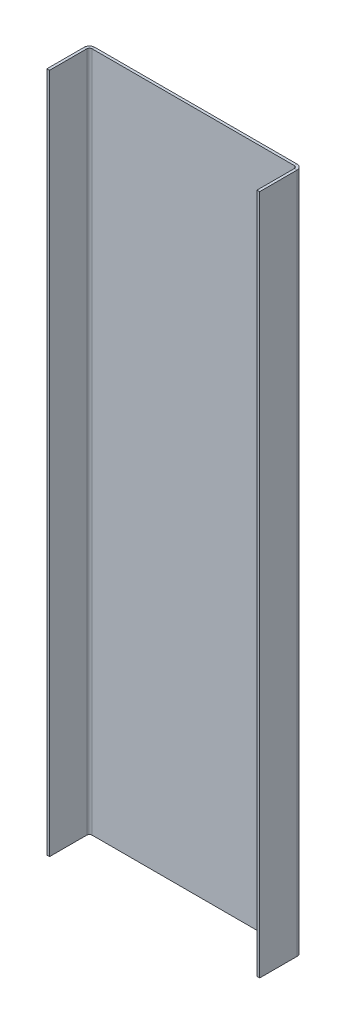
ISO-10303-21;
HEADER;
FILE_DESCRIPTION(('STEP AP214'),'2;1');
FILE_NAME('part.step','',(''),(''),'','','');
FILE_SCHEMA(('AUTOMOTIVE_DESIGN { 1 0 10303 214 1 1 1 1 }'));
ENDSEC;
DATA;
#1=APPLICATION_CONTEXT('core data for automotive mechanical design processes');
#2=APPLICATION_PROTOCOL_DEFINITION('international standard','automotive_design',2000,#1);
#3=PRODUCT_CONTEXT('',#1,'mechanical');
#4=PRODUCT('Part','Part','',(#3));
#5=PRODUCT_RELATED_PRODUCT_CATEGORY('part','',(#4));
#6=PRODUCT_DEFINITION_FORMATION('','',#4);
#7=PRODUCT_DEFINITION_CONTEXT('part definition',#1,'design');
#8=PRODUCT_DEFINITION('design','',#6,#7);
#9=PRODUCT_DEFINITION_SHAPE('','',#8);
#10=(LENGTH_UNIT() NAMED_UNIT(*) SI_UNIT(.MILLI.,.METRE.));
#11=(NAMED_UNIT(*) PLANE_ANGLE_UNIT() SI_UNIT($,.RADIAN.));
#12=(NAMED_UNIT(*) SI_UNIT($,.STERADIAN.) SOLID_ANGLE_UNIT());
#13=UNCERTAINTY_MEASURE_WITH_UNIT(LENGTH_MEASURE(1.E-05),#10,'distance_accuracy_value','');
#14=(GEOMETRIC_REPRESENTATION_CONTEXT(3) GLOBAL_UNCERTAINTY_ASSIGNED_CONTEXT((#13)) GLOBAL_UNIT_ASSIGNED_CONTEXT((#10,
#11,#12)) REPRESENTATION_CONTEXT('',''));
#15=CARTESIAN_POINT('',(0.,0.,0.));
#16=DIRECTION('',(0.,0.,1.));
#17=DIRECTION('',(1.,0.,0.));
#18=AXIS2_PLACEMENT_3D('',#15,#16,#17);
#19=CARTESIAN_POINT('',(0.,0.,1.5875));
#20=DIRECTION('',(0.,0.,-1.));
#21=DIRECTION('',(-1.,0.,0.));
#22=AXIS2_PLACEMENT_3D('',#19,#20,#21);
#23=PLANE('',#22);
#24=DIRECTION('',(0.,-1.,0.));
#25=VECTOR('',#24,1.);
#26=CARTESIAN_POINT('',(3.17499999999999,0.,1.5875));
#27=LINE('',#26,#25);
#28=CARTESIAN_POINT('',(3.17499999999999,0.,1.5875));
#29=VERTEX_POINT('',#28);
#30=CARTESIAN_POINT('',(3.17499999999999,406.4,1.5875));
#31=VERTEX_POINT('',#30);
#32=EDGE_CURVE('E228',#29,#31,#27,.F.);
#33=ORIENTED_EDGE('',*,*,#32,.F.);
#34=DIRECTION('',(1.,0.,0.));
#35=VECTOR('',#34,1.);
#36=CARTESIAN_POINT('',(0.,0.,1.5875));
#37=LINE('',#36,#35);
#38=CARTESIAN_POINT('',(123.825,0.,1.58749999999998));
#39=VERTEX_POINT('',#38);
#40=EDGE_CURVE('E94',#29,#39,#37,.T.);
#41=ORIENTED_EDGE('',*,*,#40,.T.);
#42=DIRECTION('',(0.,1.,0.));
#43=VECTOR('',#42,1.);
#44=CARTESIAN_POINT('',(123.825,406.4,1.58749999999998));
#45=LINE('',#44,#43);
#46=CARTESIAN_POINT('',(123.825,406.4,1.58749999999998));
#47=VERTEX_POINT('',#46);
#48=EDGE_CURVE('E279',#47,#39,#45,.F.);
#49=ORIENTED_EDGE('',*,*,#48,.F.);
#50=DIRECTION('',(-1.,0.,0.));
#51=VECTOR('',#50,1.);
#52=CARTESIAN_POINT('',(0.,406.4,1.5875));
#53=LINE('',#52,#51);
#54=EDGE_CURVE('E13',#47,#31,#53,.T.);
#55=ORIENTED_EDGE('',*,*,#54,.T.);
#56=EDGE_LOOP('',(#33,#41,#49,#55));
#57=FACE_BOUND('',#56,.T.);
#58=ADVANCED_FACE('F85',(#57),#23,.F.);
#59=CARTESIAN_POINT('',(0.,0.,0.));
#60=DIRECTION('',(0.,0.,-1.));
#61=DIRECTION('',(-1.,0.,0.));
#62=AXIS2_PLACEMENT_3D('',#59,#60,#61);
#63=PLANE('',#62);
#64=DIRECTION('',(-1.,0.,0.));
#65=VECTOR('',#64,1.);
#66=CARTESIAN_POINT('',(0.,0.,0.));
#67=LINE('',#66,#65);
#68=CARTESIAN_POINT('',(3.17499999999999,0.,0.));
#69=VERTEX_POINT('',#68);
#70=CARTESIAN_POINT('',(123.825,0.,0.));
#71=VERTEX_POINT('',#70);
#72=EDGE_CURVE('E89',#69,#71,#67,.F.);
#73=ORIENTED_EDGE('',*,*,#72,.F.);
#74=DIRECTION('',(0.,-1.,0.));
#75=VECTOR('',#74,1.);
#76=CARTESIAN_POINT('',(3.17499999999999,0.,0.));
#77=LINE('',#76,#75);
#78=CARTESIAN_POINT('',(3.17499999999999,406.4,0.));
#79=VERTEX_POINT('',#78);
#80=EDGE_CURVE('E217',#69,#79,#77,.F.);
#81=ORIENTED_EDGE('',*,*,#80,.T.);
#82=DIRECTION('',(-1.,0.,0.));
#83=VECTOR('',#82,1.);
#84=CARTESIAN_POINT('',(0.,406.4,0.));
#85=LINE('',#84,#83);
#86=CARTESIAN_POINT('',(123.825,406.4,0.));
#87=VERTEX_POINT('',#86);
#88=EDGE_CURVE('E288',#87,#79,#85,.T.);
#89=ORIENTED_EDGE('',*,*,#88,.F.);
#90=DIRECTION('',(0.,1.,0.));
#91=VECTOR('',#90,1.);
#92=CARTESIAN_POINT('',(123.825,406.4,0.));
#93=LINE('',#92,#91);
#94=EDGE_CURVE('E268',#87,#71,#93,.F.);
#95=ORIENTED_EDGE('',*,*,#94,.T.);
#96=EDGE_LOOP('',(#73,#81,#89,#95));
#97=FACE_BOUND('',#96,.T.);
#98=ADVANCED_FACE('F299',(#97),#63,.T.);
#99=CARTESIAN_POINT('',(0.,0.,1.5875));
#100=DIRECTION('',(0.,1.,0.));
#101=DIRECTION('',(1.,0.,0.));
#102=AXIS2_PLACEMENT_3D('',#99,#100,#101);
#103=PLANE('',#102);
#104=ORIENTED_EDGE('',*,*,#40,.F.);
#105=DIRECTION('',(0.,0.,-1.));
#106=VECTOR('',#105,1.);
#107=CARTESIAN_POINT('',(3.17499999999999,0.,1.5875));
#108=LINE('',#107,#106);
#109=EDGE_CURVE('E222',#29,#69,#108,.T.);
#110=ORIENTED_EDGE('',*,*,#109,.T.);
#111=ORIENTED_EDGE('',*,*,#72,.T.);
#112=DIRECTION('',(0.,0.,-1.));
#113=VECTOR('',#112,1.);
#114=CARTESIAN_POINT('',(123.825,0.,1.58749999999998));
#115=LINE('',#114,#113);
#116=EDGE_CURVE('E283',#39,#71,#115,.T.);
#117=ORIENTED_EDGE('',*,*,#116,.F.);
#118=EDGE_LOOP('',(#104,#110,#111,#117));
#119=FACE_BOUND('',#118,.T.);
#120=ADVANCED_FACE('F87',(#119),#103,.F.);
#121=CARTESIAN_POINT('',(0.,406.4,1.5875));
#122=DIRECTION('',(0.,-1.,0.));
#123=DIRECTION('',(-1.,0.,0.));
#124=AXIS2_PLACEMENT_3D('',#121,#122,#123);
#125=PLANE('',#124);
#126=DIRECTION('',(0.,0.,-1.));
#127=VECTOR('',#126,1.);
#128=CARTESIAN_POINT('',(3.17499999999999,406.4,1.5875));
#129=LINE('',#128,#127);
#130=EDGE_CURVE('E233',#31,#79,#129,.T.);
#131=ORIENTED_EDGE('',*,*,#130,.F.);
#132=ORIENTED_EDGE('',*,*,#54,.F.);
#133=DIRECTION('',(0.,0.,-1.));
#134=VECTOR('',#133,1.);
#135=CARTESIAN_POINT('',(123.825,406.4,1.58749999999998));
#136=LINE('',#135,#134);
#137=EDGE_CURVE('E273',#47,#87,#136,.T.);
#138=ORIENTED_EDGE('',*,*,#137,.T.);
#139=ORIENTED_EDGE('',*,*,#88,.T.);
#140=EDGE_LOOP('',(#131,#132,#138,#139));
#141=FACE_BOUND('',#140,.T.);
#142=ADVANCED_FACE('F307',(#141),#125,.F.);
#143=CARTESIAN_POINT('',(123.825,0.,3.17499999999999));
#144=DIRECTION('',(0.,-1.,0.));
#145=DIRECTION('',(0.,0.,-1.));
#146=AXIS2_PLACEMENT_3D('',#143,#144,#145);
#147=PLANE('',#146);
#148=DIRECTION('',(-1.,0.,0.));
#149=VECTOR('',#148,1.);
#150=CARTESIAN_POINT('',(127.,0.,3.17499999999998));
#151=LINE('',#150,#149);
#152=CARTESIAN_POINT('',(125.4125,0.,3.17499999999998));
#153=VERTEX_POINT('',#152);
#154=CARTESIAN_POINT('',(127.,0.,3.17499999999998));
#155=VERTEX_POINT('',#154);
#156=EDGE_CURVE('E235',#153,#155,#151,.F.);
#157=ORIENTED_EDGE('',*,*,#156,.F.);
#158=CARTESIAN_POINT('',(123.825,0.,3.17499999999999));
#159=DIRECTION('',(0.,1.,0.));
#160=DIRECTION('',(0.,0.,1.));
#161=AXIS2_PLACEMENT_3D('',#158,#159,#160);
#162=CIRCLE('',#161,1.58750000000001);
#163=EDGE_CURVE('E276',#39,#153,#162,.F.);
#164=ORIENTED_EDGE('',*,*,#163,.F.);
#165=ORIENTED_EDGE('',*,*,#116,.T.);
#166=CARTESIAN_POINT('',(123.825,0.,3.17499999999999));
#167=DIRECTION('',(0.,1.,0.));
#168=DIRECTION('',(0.,0.,1.));
#169=AXIS2_PLACEMENT_3D('',#166,#167,#168);
#170=CIRCLE('',#169,3.17500000000001);
#171=EDGE_CURVE('E102',#71,#155,#170,.F.);
#172=ORIENTED_EDGE('',*,*,#171,.T.);
#173=EDGE_LOOP('',(#157,#164,#165,#172));
#174=FACE_BOUND('',#173,.T.);
#175=ADVANCED_FACE('F316',(#174),#147,.T.);
#176=CARTESIAN_POINT('',(123.825,406.4,3.17499999999999));
#177=DIRECTION('',(0.,-1.,0.));
#178=DIRECTION('',(0.,0.,-1.));
#179=AXIS2_PLACEMENT_3D('',#176,#177,#178);
#180=PLANE('',#179);
#181=CARTESIAN_POINT('',(123.825,406.4,3.17499999999999));
#182=DIRECTION('',(0.,1.,0.));
#183=DIRECTION('',(0.,0.,1.));
#184=AXIS2_PLACEMENT_3D('',#181,#182,#183);
#185=CIRCLE('',#184,1.58750000000001);
#186=CARTESIAN_POINT('',(125.4125,406.4,3.17499999999998));
#187=VERTEX_POINT('',#186);
#188=EDGE_CURVE('E241',#187,#47,#185,.T.);
#189=ORIENTED_EDGE('',*,*,#188,.F.);
#190=DIRECTION('',(-1.,0.,0.));
#191=VECTOR('',#190,1.);
#192=CARTESIAN_POINT('',(125.4125,406.4,3.17499999999998));
#193=LINE('',#192,#191);
#194=CARTESIAN_POINT('',(127.,406.4,3.17499999999998));
#195=VERTEX_POINT('',#194);
#196=EDGE_CURVE('E261',#187,#195,#193,.F.);
#197=ORIENTED_EDGE('',*,*,#196,.T.);
#198=CARTESIAN_POINT('',(123.825,406.4,3.17499999999999));
#199=DIRECTION('',(0.,1.,0.));
#200=DIRECTION('',(0.,0.,1.));
#201=AXIS2_PLACEMENT_3D('',#198,#199,#200);
#202=CIRCLE('',#201,3.17500000000001);
#203=EDGE_CURVE('E271',#195,#87,#202,.T.);
#204=ORIENTED_EDGE('',*,*,#203,.T.);
#205=ORIENTED_EDGE('',*,*,#137,.F.);
#206=EDGE_LOOP('',(#189,#197,#204,#205));
#207=FACE_BOUND('',#206,.T.);
#208=ADVANCED_FACE('F303',(#207),#180,.F.);
#209=CARTESIAN_POINT('',(123.825,406.4,3.17499999999999));
#210=DIRECTION('',(0.,1.,0.));
#211=DIRECTION('',(1.,0.,0.));
#212=AXIS2_PLACEMENT_3D('',#209,#210,#211);
#213=CYLINDRICAL_SURFACE('',#212,3.17500000000001);
#214=ORIENTED_EDGE('',*,*,#94,.F.);
#215=ORIENTED_EDGE('',*,*,#203,.F.);
#216=DIRECTION('',(0.,1.,0.));
#217=VECTOR('',#216,1.);
#218=CARTESIAN_POINT('',(127.,0.,3.17499999999998));
#219=LINE('',#218,#217);
#220=EDGE_CURVE('E259',#195,#155,#219,.F.);
#221=ORIENTED_EDGE('',*,*,#220,.T.);
#222=ORIENTED_EDGE('',*,*,#171,.F.);
#223=EDGE_LOOP('',(#214,#215,#221,#222));
#224=FACE_BOUND('',#223,.T.);
#225=ADVANCED_FACE('F300',(#224),#213,.T.);
#226=CARTESIAN_POINT('',(123.825,406.4,3.17499999999999));
#227=DIRECTION('',(0.,1.,0.));
#228=DIRECTION('',(1.,0.,0.));
#229=AXIS2_PLACEMENT_3D('',#226,#227,#228);
#230=CYLINDRICAL_SURFACE('',#229,1.58750000000001);
#231=ORIENTED_EDGE('',*,*,#48,.T.);
#232=ORIENTED_EDGE('',*,*,#163,.T.);
#233=DIRECTION('',(0.,1.,0.));
#234=VECTOR('',#233,1.);
#235=CARTESIAN_POINT('',(125.4125,0.,3.17499999999998));
#236=LINE('',#235,#234);
#237=EDGE_CURVE('E264',#153,#187,#236,.T.);
#238=ORIENTED_EDGE('',*,*,#237,.T.);
#239=ORIENTED_EDGE('',*,*,#188,.T.);
#240=EDGE_LOOP('',(#231,#232,#238,#239));
#241=FACE_BOUND('',#240,.T.);
#242=ADVANCED_FACE('F313',(#241),#230,.F.);
#243=CARTESIAN_POINT('',(127.,406.4,25.4));
#244=DIRECTION('',(0.,-1.,0.));
#245=DIRECTION('',(0.,0.,-1.));
#246=AXIS2_PLACEMENT_3D('',#243,#244,#245);
#247=PLANE('',#246);
#248=ORIENTED_EDGE('',*,*,#196,.F.);
#249=DIRECTION('',(0.,0.,-1.));
#250=VECTOR('',#249,1.);
#251=CARTESIAN_POINT('',(125.4125,406.4,25.4));
#252=LINE('',#251,#250);
#253=CARTESIAN_POINT('',(125.4125,406.4,25.4));
#254=VERTEX_POINT('',#253);
#255=EDGE_CURVE('E257',#187,#254,#252,.F.);
#256=ORIENTED_EDGE('',*,*,#255,.T.);
#257=DIRECTION('',(-1.,0.,0.));
#258=VECTOR('',#257,1.);
#259=CARTESIAN_POINT('',(127.,406.4,25.4));
#260=LINE('',#259,#258);
#261=CARTESIAN_POINT('',(127.,406.4,25.4));
#262=VERTEX_POINT('',#261);
#263=EDGE_CURVE('E238',#262,#254,#260,.T.);
#264=ORIENTED_EDGE('',*,*,#263,.F.);
#265=DIRECTION('',(0.,0.,1.));
#266=VECTOR('',#265,1.);
#267=CARTESIAN_POINT('',(127.,406.4,-4.49631936475476E-13));
#268=LINE('',#267,#266);
#269=EDGE_CURVE('E250',#195,#262,#268,.T.);
#270=ORIENTED_EDGE('',*,*,#269,.F.);
#271=EDGE_LOOP('',(#248,#256,#264,#270));
#272=FACE_BOUND('',#271,.T.);
#273=ADVANCED_FACE('F334',(#272),#247,.F.);
#274=CARTESIAN_POINT('',(127.,0.,1.58749999999999));
#275=DIRECTION('',(0.,1.,0.));
#276=DIRECTION('',(0.,0.,1.));
#277=AXIS2_PLACEMENT_3D('',#274,#275,#276);
#278=PLANE('',#277);
#279=ORIENTED_EDGE('',*,*,#156,.T.);
#280=DIRECTION('',(0.,0.,-1.));
#281=VECTOR('',#280,1.);
#282=CARTESIAN_POINT('',(127.,0.,-4.49631936475476E-13));
#283=LINE('',#282,#281);
#284=CARTESIAN_POINT('',(127.,0.,25.4));
#285=VERTEX_POINT('',#284);
#286=EDGE_CURVE('E245',#285,#155,#283,.T.);
#287=ORIENTED_EDGE('',*,*,#286,.F.);
#288=DIRECTION('',(-1.,0.,0.));
#289=VECTOR('',#288,1.);
#290=CARTESIAN_POINT('',(127.,0.,25.4));
#291=LINE('',#290,#289);
#292=CARTESIAN_POINT('',(125.4125,0.,25.4));
#293=VERTEX_POINT('',#292);
#294=EDGE_CURVE('E242',#285,#293,#291,.T.);
#295=ORIENTED_EDGE('',*,*,#294,.T.);
#296=DIRECTION('',(0.,0.,1.));
#297=VECTOR('',#296,1.);
#298=CARTESIAN_POINT('',(125.4125,0.,1.5875));
#299=LINE('',#298,#297);
#300=EDGE_CURVE('E252',#293,#153,#299,.F.);
#301=ORIENTED_EDGE('',*,*,#300,.T.);
#302=EDGE_LOOP('',(#279,#287,#295,#301));
#303=FACE_BOUND('',#302,.T.);
#304=ADVANCED_FACE('F319',(#303),#278,.F.);
#305=CARTESIAN_POINT('',(127.,0.,-4.49631936475476E-13));
#306=DIRECTION('',(-1.,0.,0.));
#307=DIRECTION('',(0.,0.,1.));
#308=AXIS2_PLACEMENT_3D('',#305,#306,#307);
#309=PLANE('',#308);
#310=ORIENTED_EDGE('',*,*,#220,.F.);
#311=ORIENTED_EDGE('',*,*,#269,.T.);
#312=DIRECTION('',(0.,-1.,0.));
#313=VECTOR('',#312,1.);
#314=CARTESIAN_POINT('',(127.,0.,25.4));
#315=LINE('',#314,#313);
#316=EDGE_CURVE('E248',#262,#285,#315,.T.);
#317=ORIENTED_EDGE('',*,*,#316,.T.);
#318=ORIENTED_EDGE('',*,*,#286,.T.);
#319=EDGE_LOOP('',(#310,#311,#317,#318));
#320=FACE_BOUND('',#319,.T.);
#321=ADVANCED_FACE('F322',(#320),#309,.F.);
#322=CARTESIAN_POINT('',(125.4125,0.,-4.44089209850063E-13));
#323=DIRECTION('',(-1.,0.,0.));
#324=DIRECTION('',(0.,0.,1.));
#325=AXIS2_PLACEMENT_3D('',#322,#323,#324);
#326=PLANE('',#325);
#327=ORIENTED_EDGE('',*,*,#255,.F.);
#328=ORIENTED_EDGE('',*,*,#237,.F.);
#329=ORIENTED_EDGE('',*,*,#300,.F.);
#330=DIRECTION('',(0.,1.,0.));
#331=VECTOR('',#330,1.);
#332=CARTESIAN_POINT('',(125.4125,0.,25.4));
#333=LINE('',#332,#331);
#334=EDGE_CURVE('E255',#254,#293,#333,.F.);
#335=ORIENTED_EDGE('',*,*,#334,.F.);
#336=EDGE_LOOP('',(#327,#328,#329,#335));
#337=FACE_BOUND('',#336,.T.);
#338=ADVANCED_FACE('F332',(#337),#326,.T.);
#339=CARTESIAN_POINT('',(127.,0.,25.4));
#340=DIRECTION('',(0.,0.,-1.));
#341=DIRECTION('',(-1.,0.,0.));
#342=AXIS2_PLACEMENT_3D('',#339,#340,#341);
#343=PLANE('',#342);
#344=ORIENTED_EDGE('',*,*,#334,.T.);
#345=ORIENTED_EDGE('',*,*,#294,.F.);
#346=ORIENTED_EDGE('',*,*,#316,.F.);
#347=ORIENTED_EDGE('',*,*,#263,.T.);
#348=EDGE_LOOP('',(#344,#345,#346,#347));
#349=FACE_BOUND('',#348,.T.);
#350=ADVANCED_FACE('F328',(#349),#343,.F.);
#351=CARTESIAN_POINT('',(3.17499999999999,406.4,3.175));
#352=DIRECTION('',(0.,1.,0.));
#353=DIRECTION('',(0.,0.,1.));
#354=AXIS2_PLACEMENT_3D('',#351,#352,#353);
#355=PLANE('',#354);
#356=DIRECTION('',(1.,0.,0.));
#357=VECTOR('',#356,1.);
#358=CARTESIAN_POINT('',(0.,406.4,3.17499999999999));
#359=LINE('',#358,#357);
#360=CARTESIAN_POINT('',(1.58749999999999,406.4,3.17499999999999));
#361=VERTEX_POINT('',#360);
#362=CARTESIAN_POINT('',(0.,406.4,3.17499999999999));
#363=VERTEX_POINT('',#362);
#364=EDGE_CURVE('E200',#361,#363,#359,.F.);
#365=ORIENTED_EDGE('',*,*,#364,.F.);
#366=CARTESIAN_POINT('',(3.17499999999999,406.4,3.175));
#367=DIRECTION('',(0.,-1.,0.));
#368=DIRECTION('',(0.,0.,-1.));
#369=AXIS2_PLACEMENT_3D('',#366,#367,#368);
#370=CIRCLE('',#369,1.5875);
#371=EDGE_CURVE('E225',#31,#361,#370,.F.);
#372=ORIENTED_EDGE('',*,*,#371,.F.);
#373=ORIENTED_EDGE('',*,*,#130,.T.);
#374=CARTESIAN_POINT('',(3.17499999999999,406.4,3.175));
#375=DIRECTION('',(0.,-1.,0.));
#376=DIRECTION('',(0.,0.,-1.));
#377=AXIS2_PLACEMENT_3D('',#374,#375,#376);
#378=CIRCLE('',#377,3.175);
#379=EDGE_CURVE('E110',#79,#363,#378,.F.);
#380=ORIENTED_EDGE('',*,*,#379,.T.);
#381=EDGE_LOOP('',(#365,#372,#373,#380));
#382=FACE_BOUND('',#381,.T.);
#383=ADVANCED_FACE('F444',(#382),#355,.T.);
#384=CARTESIAN_POINT('',(3.17499999999999,0.,3.175));
#385=DIRECTION('',(0.,1.,0.));
#386=DIRECTION('',(0.,0.,1.));
#387=AXIS2_PLACEMENT_3D('',#384,#385,#386);
#388=PLANE('',#387);
#389=CARTESIAN_POINT('',(3.17499999999999,0.,3.175));
#390=DIRECTION('',(0.,-1.,0.));
#391=DIRECTION('',(0.,0.,-1.));
#392=AXIS2_PLACEMENT_3D('',#389,#390,#391);
#393=CIRCLE('',#392,1.5875);
#394=CARTESIAN_POINT('',(1.58749999999999,0.,3.17499999999999));
#395=VERTEX_POINT('',#394);
#396=EDGE_CURVE('E230',#395,#29,#393,.T.);
#397=ORIENTED_EDGE('',*,*,#396,.F.);
#398=DIRECTION('',(1.,0.,0.));
#399=VECTOR('',#398,1.);
#400=CARTESIAN_POINT('',(1.58749999999999,0.,3.17499999999999));
#401=LINE('',#400,#399);
#402=CARTESIAN_POINT('',(0.,0.,3.17499999999999));
#403=VERTEX_POINT('',#402);
#404=EDGE_CURVE('E211',#395,#403,#401,.F.);
#405=ORIENTED_EDGE('',*,*,#404,.T.);
#406=CARTESIAN_POINT('',(3.17499999999999,0.,3.175));
#407=DIRECTION('',(0.,-1.,0.));
#408=DIRECTION('',(0.,0.,-1.));
#409=AXIS2_PLACEMENT_3D('',#406,#407,#408);
#410=CIRCLE('',#409,3.175);
#411=EDGE_CURVE('E220',#403,#69,#410,.T.);
#412=ORIENTED_EDGE('',*,*,#411,.T.);
#413=ORIENTED_EDGE('',*,*,#109,.F.);
#414=EDGE_LOOP('',(#397,#405,#412,#413));
#415=FACE_BOUND('',#414,.T.);
#416=ADVANCED_FACE('F453',(#415),#388,.F.);
#417=CARTESIAN_POINT('',(3.17499999999999,0.,3.175));
#418=DIRECTION('',(0.,-1.,0.));
#419=DIRECTION('',(-1.,0.,0.));
#420=AXIS2_PLACEMENT_3D('',#417,#418,#419);
#421=CYLINDRICAL_SURFACE('',#420,3.175);
#422=ORIENTED_EDGE('',*,*,#80,.F.);
#423=ORIENTED_EDGE('',*,*,#411,.F.);
#424=DIRECTION('',(0.,-1.,0.));
#425=VECTOR('',#424,1.);
#426=CARTESIAN_POINT('',(0.,406.4,3.17499999999999));
#427=LINE('',#426,#425);
#428=EDGE_CURVE('E209',#403,#363,#427,.F.);
#429=ORIENTED_EDGE('',*,*,#428,.T.);
#430=ORIENTED_EDGE('',*,*,#379,.F.);
#431=EDGE_LOOP('',(#422,#423,#429,#430));
#432=FACE_BOUND('',#431,.T.);
#433=ADVANCED_FACE('F464',(#432),#421,.T.);
#434=CARTESIAN_POINT('',(3.17499999999999,0.,3.175));
#435=DIRECTION('',(0.,-1.,0.));
#436=DIRECTION('',(-1.,0.,0.));
#437=AXIS2_PLACEMENT_3D('',#434,#435,#436);
#438=CYLINDRICAL_SURFACE('',#437,1.5875);
#439=ORIENTED_EDGE('',*,*,#32,.T.);
#440=ORIENTED_EDGE('',*,*,#371,.T.);
#441=DIRECTION('',(0.,-1.,0.));
#442=VECTOR('',#441,1.);
#443=CARTESIAN_POINT('',(1.58749999999999,406.4,3.17499999999999));
#444=LINE('',#443,#442);
#445=EDGE_CURVE('E214',#361,#395,#444,.T.);
#446=ORIENTED_EDGE('',*,*,#445,.T.);
#447=ORIENTED_EDGE('',*,*,#396,.T.);
#448=EDGE_LOOP('',(#439,#440,#446,#447));
#449=FACE_BOUND('',#448,.T.);
#450=ADVANCED_FACE('F475',(#449),#438,.F.);
#451=CARTESIAN_POINT('',(0.,406.4,1.58749999999999));
#452=DIRECTION('',(0.,-1.,0.));
#453=DIRECTION('',(0.,0.,-1.));
#454=AXIS2_PLACEMENT_3D('',#451,#452,#453);
#455=PLANE('',#454);
#456=ORIENTED_EDGE('',*,*,#364,.T.);
#457=DIRECTION('',(0.,0.,-1.));
#458=VECTOR('',#457,1.);
#459=CARTESIAN_POINT('',(0.,406.4,0.));
#460=LINE('',#459,#458);
#461=CARTESIAN_POINT('',(0.,406.4,25.4));
#462=VERTEX_POINT('',#461);
#463=EDGE_CURVE('E181',#462,#363,#460,.T.);
#464=ORIENTED_EDGE('',*,*,#463,.F.);
#465=DIRECTION('',(1.,0.,0.));
#466=VECTOR('',#465,1.);
#467=CARTESIAN_POINT('',(0.,406.4,25.4));
#468=LINE('',#467,#466);
#469=CARTESIAN_POINT('',(1.58749999999992,406.4,25.4));
#470=VERTEX_POINT('',#469);
#471=EDGE_CURVE('E187',#462,#470,#468,.T.);
#472=ORIENTED_EDGE('',*,*,#471,.T.);
#473=DIRECTION('',(0.,0.,1.));
#474=VECTOR('',#473,1.);
#475=CARTESIAN_POINT('',(1.5875,406.4,1.5875));
#476=LINE('',#475,#474);
#477=EDGE_CURVE('E207',#470,#361,#476,.F.);
#478=ORIENTED_EDGE('',*,*,#477,.T.);
#479=EDGE_LOOP('',(#456,#464,#472,#478));
#480=FACE_BOUND('',#479,.T.);
#481=ADVANCED_FACE('F199',(#480),#455,.F.);
#482=CARTESIAN_POINT('',(0.,0.,25.4));
#483=DIRECTION('',(0.,1.,0.));
#484=DIRECTION('',(0.,0.,1.));
#485=AXIS2_PLACEMENT_3D('',#482,#483,#484);
#486=PLANE('',#485);
#487=ORIENTED_EDGE('',*,*,#404,.F.);
#488=DIRECTION('',(0.,0.,-1.));
#489=VECTOR('',#488,1.);
#490=CARTESIAN_POINT('',(1.58749999999992,0.,25.4));
#491=LINE('',#490,#489);
#492=CARTESIAN_POINT('',(1.58749999999992,0.,25.4));
#493=VERTEX_POINT('',#492);
#494=EDGE_CURVE('E203',#395,#493,#491,.F.);
#495=ORIENTED_EDGE('',*,*,#494,.T.);
#496=DIRECTION('',(1.,0.,0.));
#497=VECTOR('',#496,1.);
#498=CARTESIAN_POINT('',(0.,0.,25.4));
#499=LINE('',#498,#497);
#500=CARTESIAN_POINT('',(0.,0.,25.4));
#501=VERTEX_POINT('',#500);
#502=EDGE_CURVE('E196',#501,#493,#499,.T.);
#503=ORIENTED_EDGE('',*,*,#502,.F.);
#504=DIRECTION('',(0.,0.,1.));
#505=VECTOR('',#504,1.);
#506=CARTESIAN_POINT('',(0.,0.,0.));
#507=LINE('',#506,#505);
#508=EDGE_CURVE('E183',#403,#501,#507,.T.);
#509=ORIENTED_EDGE('',*,*,#508,.F.);
#510=EDGE_LOOP('',(#487,#495,#503,#509));
#511=FACE_BOUND('',#510,.T.);
#512=ADVANCED_FACE('F495',(#511),#486,.F.);
#513=CARTESIAN_POINT('',(0.,0.,0.));
#514=DIRECTION('',(1.,0.,0.));
#515=DIRECTION('',(0.,0.,-1.));
#516=AXIS2_PLACEMENT_3D('',#513,#514,#515);
#517=PLANE('',#516);
#518=ORIENTED_EDGE('',*,*,#428,.F.);
#519=ORIENTED_EDGE('',*,*,#508,.T.);
#520=DIRECTION('',(0.,1.,0.));
#521=VECTOR('',#520,1.);
#522=CARTESIAN_POINT('',(0.,0.,25.4));
#523=LINE('',#522,#521);
#524=EDGE_CURVE('E176',#501,#462,#523,.T.);
#525=ORIENTED_EDGE('',*,*,#524,.T.);
#526=ORIENTED_EDGE('',*,*,#463,.T.);
#527=EDGE_LOOP('',(#518,#519,#525,#526));
#528=FACE_BOUND('',#527,.T.);
#529=ADVANCED_FACE('F179',(#528),#517,.F.);
#530=CARTESIAN_POINT('',(1.58750000000001,0.,0.));
#531=DIRECTION('',(1.,0.,0.));
#532=DIRECTION('',(0.,0.,-1.));
#533=AXIS2_PLACEMENT_3D('',#530,#531,#532);
#534=PLANE('',#533);
#535=ORIENTED_EDGE('',*,*,#494,.F.);
#536=ORIENTED_EDGE('',*,*,#445,.F.);
#537=ORIENTED_EDGE('',*,*,#477,.F.);
#538=DIRECTION('',(0.,-1.,0.));
#539=VECTOR('',#538,1.);
#540=CARTESIAN_POINT('',(1.58749999999992,406.4,25.4));
#541=LINE('',#540,#539);
#542=EDGE_CURVE('E192',#493,#470,#541,.F.);
#543=ORIENTED_EDGE('',*,*,#542,.F.);
#544=EDGE_LOOP('',(#535,#536,#537,#543));
#545=FACE_BOUND('',#544,.T.);
#546=ADVANCED_FACE('F515',(#545),#534,.T.);
#547=CARTESIAN_POINT('',(0.,406.4,25.4));
#548=DIRECTION('',(0.,0.,-1.));
#549=DIRECTION('',(-1.,0.,0.));
#550=AXIS2_PLACEMENT_3D('',#547,#548,#549);
#551=PLANE('',#550);
#552=ORIENTED_EDGE('',*,*,#542,.T.);
#553=ORIENTED_EDGE('',*,*,#471,.F.);
#554=ORIENTED_EDGE('',*,*,#524,.F.);
#555=ORIENTED_EDGE('',*,*,#502,.T.);
#556=EDGE_LOOP('',(#552,#553,#554,#555));
#557=FACE_BOUND('',#556,.T.);
#558=ADVANCED_FACE('F190',(#557),#551,.F.);
#559=CLOSED_SHELL('',(#58,#98,#120,#142,#175,#208,#225,#242,#273,#304,#321,#338,#350,#383,#416,
#433,#450,#481,#512,#529,#546,#558));
#560=MANIFOLD_SOLID_BREP('B2',#559);
#561=ADVANCED_BREP_SHAPE_REPRESENTATION('',(#18,#560),#14);
#562=SHAPE_DEFINITION_REPRESENTATION(#9,#561);
ENDSEC;
END-ISO-10303-21;
